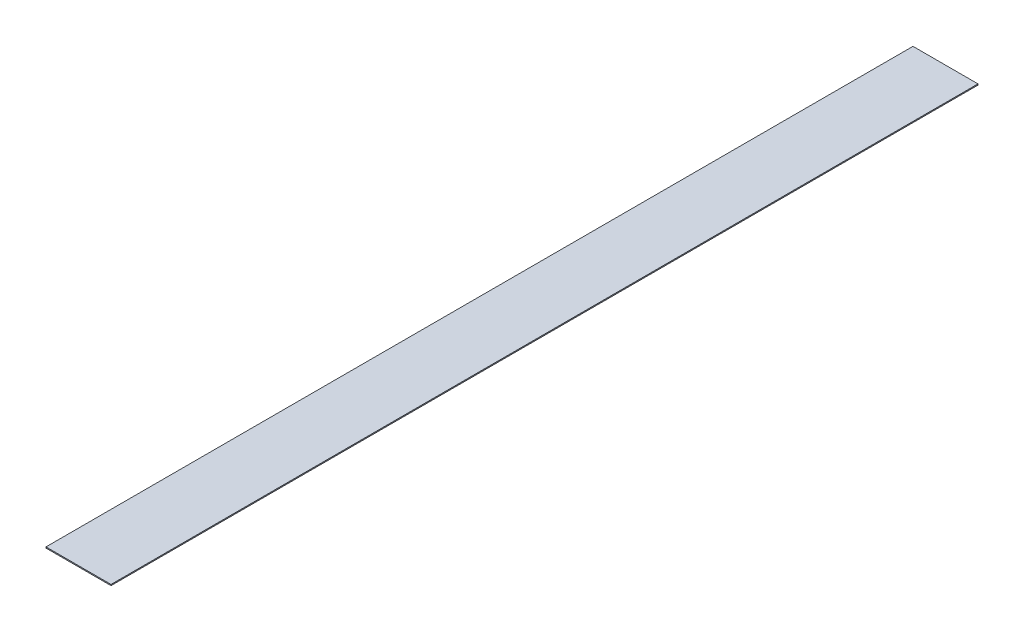
ISO-10303-21;
HEADER;
FILE_DESCRIPTION(('STEP AP214'),'2;1');
FILE_NAME('part.step','',(''),(''),'','','');
FILE_SCHEMA(('AUTOMOTIVE_DESIGN { 1 0 10303 214 1 1 1 1 }'));
ENDSEC;
DATA;
#1=APPLICATION_CONTEXT('core data for automotive mechanical design processes');
#2=APPLICATION_PROTOCOL_DEFINITION('international standard','automotive_design',2000,#1);
#3=PRODUCT_CONTEXT('',#1,'mechanical');
#4=PRODUCT('Part','Part','',(#3));
#5=PRODUCT_RELATED_PRODUCT_CATEGORY('part','',(#4));
#6=PRODUCT_DEFINITION_FORMATION('','',#4);
#7=PRODUCT_DEFINITION_CONTEXT('part definition',#1,'design');
#8=PRODUCT_DEFINITION('design','',#6,#7);
#9=PRODUCT_DEFINITION_SHAPE('','',#8);
#10=(LENGTH_UNIT() NAMED_UNIT(*) SI_UNIT(.MILLI.,.METRE.));
#11=(NAMED_UNIT(*) PLANE_ANGLE_UNIT() SI_UNIT($,.RADIAN.));
#12=(NAMED_UNIT(*) SI_UNIT($,.STERADIAN.) SOLID_ANGLE_UNIT());
#13=UNCERTAINTY_MEASURE_WITH_UNIT(LENGTH_MEASURE(1.E-05),#10,'distance_accuracy_value','');
#14=(GEOMETRIC_REPRESENTATION_CONTEXT(3) GLOBAL_UNCERTAINTY_ASSIGNED_CONTEXT((#13)) GLOBAL_UNIT_ASSIGNED_CONTEXT((#10,
#11,#12)) REPRESENTATION_CONTEXT('',''));
#15=CARTESIAN_POINT('',(0.,0.,0.));
#16=DIRECTION('',(0.,0.,1.));
#17=DIRECTION('',(1.,0.,0.));
#18=AXIS2_PLACEMENT_3D('',#15,#16,#17);
#19=CARTESIAN_POINT('',(-3000.,-100.,-40000.));
#20=DIRECTION('',(-1.,0.,0.));
#21=DIRECTION('',(0.,0.,1.));
#22=AXIS2_PLACEMENT_3D('',#19,#20,#21);
#23=PLANE('',#22);
#24=DIRECTION('',(0.,0.,1.));
#25=VECTOR('',#24,1.);
#26=CARTESIAN_POINT('',(-3000.,0.,-40000.));
#27=LINE('',#26,#25);
#28=CARTESIAN_POINT('',(-3000.,0.,-40000.));
#29=VERTEX_POINT('',#28);
#30=CARTESIAN_POINT('',(-3000.,0.,40000.));
#31=VERTEX_POINT('',#30);
#32=EDGE_CURVE('E111',#29,#31,#27,.T.);
#33=ORIENTED_EDGE('',*,*,#32,.F.);
#34=DIRECTION('',(0.,1.,0.));
#35=VECTOR('',#34,1.);
#36=CARTESIAN_POINT('',(-3000.,-100.,-40000.));
#37=LINE('',#36,#35);
#38=CARTESIAN_POINT('',(-3000.,-100.,-40000.));
#39=VERTEX_POINT('',#38);
#40=EDGE_CURVE('E11',#39,#29,#37,.T.);
#41=ORIENTED_EDGE('',*,*,#40,.F.);
#42=DIRECTION('',(0.,0.,1.));
#43=VECTOR('',#42,1.);
#44=CARTESIAN_POINT('',(-3000.,-100.,-40000.));
#45=LINE('',#44,#43);
#46=CARTESIAN_POINT('',(-3000.,-100.,40000.));
#47=VERTEX_POINT('',#46);
#48=EDGE_CURVE('E105',#39,#47,#45,.T.);
#49=ORIENTED_EDGE('',*,*,#48,.T.);
#50=DIRECTION('',(0.,1.,0.));
#51=VECTOR('',#50,1.);
#52=CARTESIAN_POINT('',(-3000.,-100.,40000.));
#53=LINE('',#52,#51);
#54=EDGE_CURVE('E50',#47,#31,#53,.T.);
#55=ORIENTED_EDGE('',*,*,#54,.T.);
#56=EDGE_LOOP('',(#33,#41,#49,#55));
#57=FACE_BOUND('',#56,.T.);
#58=ADVANCED_FACE('F47',(#57),#23,.T.);
#59=CARTESIAN_POINT('',(-3000.,-100.,-40000.));
#60=DIRECTION('',(0.,0.,-1.));
#61=DIRECTION('',(-1.,0.,0.));
#62=AXIS2_PLACEMENT_3D('',#59,#60,#61);
#63=PLANE('',#62);
#64=DIRECTION('',(-1.,0.,0.));
#65=VECTOR('',#64,1.);
#66=CARTESIAN_POINT('',(-3000.,0.,-40000.));
#67=LINE('',#66,#65);
#68=CARTESIAN_POINT('',(3000.,0.,-40000.));
#69=VERTEX_POINT('',#68);
#70=EDGE_CURVE('E107',#69,#29,#67,.T.);
#71=ORIENTED_EDGE('',*,*,#70,.F.);
#72=DIRECTION('',(0.,1.,0.));
#73=VECTOR('',#72,1.);
#74=CARTESIAN_POINT('',(3000.,-100.,-40000.));
#75=LINE('',#74,#73);
#76=CARTESIAN_POINT('',(3000.,-100.,-40000.));
#77=VERTEX_POINT('',#76);
#78=EDGE_CURVE('E56',#77,#69,#75,.T.);
#79=ORIENTED_EDGE('',*,*,#78,.F.);
#80=DIRECTION('',(-1.,0.,0.));
#81=VECTOR('',#80,1.);
#82=CARTESIAN_POINT('',(-3000.,-100.,-40000.));
#83=LINE('',#82,#81);
#84=EDGE_CURVE('E102',#77,#39,#83,.T.);
#85=ORIENTED_EDGE('',*,*,#84,.T.);
#86=ORIENTED_EDGE('',*,*,#40,.T.);
#87=EDGE_LOOP('',(#71,#79,#85,#86));
#88=FACE_BOUND('',#87,.T.);
#89=ADVANCED_FACE('F121',(#88),#63,.T.);
#90=CARTESIAN_POINT('',(3000.,-100.,-40000.));
#91=DIRECTION('',(1.,0.,0.));
#92=DIRECTION('',(0.,0.,-1.));
#93=AXIS2_PLACEMENT_3D('',#90,#91,#92);
#94=PLANE('',#93);
#95=DIRECTION('',(0.,0.,-1.));
#96=VECTOR('',#95,1.);
#97=CARTESIAN_POINT('',(3000.,0.,-40000.));
#98=LINE('',#97,#96);
#99=CARTESIAN_POINT('',(3000.,0.,40000.));
#100=VERTEX_POINT('',#99);
#101=EDGE_CURVE('E97',#100,#69,#98,.T.);
#102=ORIENTED_EDGE('',*,*,#101,.F.);
#103=DIRECTION('',(0.,1.,0.));
#104=VECTOR('',#103,1.);
#105=CARTESIAN_POINT('',(3000.,-100.,40000.));
#106=LINE('',#105,#104);
#107=CARTESIAN_POINT('',(3000.,-100.,40000.));
#108=VERTEX_POINT('',#107);
#109=EDGE_CURVE('E92',#108,#100,#106,.T.);
#110=ORIENTED_EDGE('',*,*,#109,.F.);
#111=DIRECTION('',(0.,0.,-1.));
#112=VECTOR('',#111,1.);
#113=CARTESIAN_POINT('',(3000.,-100.,-40000.));
#114=LINE('',#113,#112);
#115=EDGE_CURVE('E95',#108,#77,#114,.T.);
#116=ORIENTED_EDGE('',*,*,#115,.T.);
#117=ORIENTED_EDGE('',*,*,#78,.T.);
#118=EDGE_LOOP('',(#102,#110,#116,#117));
#119=FACE_BOUND('',#118,.T.);
#120=ADVANCED_FACE('F94',(#119),#94,.T.);
#121=CARTESIAN_POINT('',(-3000.,-100.,40000.));
#122=DIRECTION('',(0.,0.,1.));
#123=DIRECTION('',(1.,0.,0.));
#124=AXIS2_PLACEMENT_3D('',#121,#122,#123);
#125=PLANE('',#124);
#126=DIRECTION('',(1.,0.,0.));
#127=VECTOR('',#126,1.);
#128=CARTESIAN_POINT('',(-3000.,0.,40000.));
#129=LINE('',#128,#127);
#130=EDGE_CURVE('E114',#31,#100,#129,.T.);
#131=ORIENTED_EDGE('',*,*,#130,.F.);
#132=ORIENTED_EDGE('',*,*,#54,.F.);
#133=DIRECTION('',(1.,0.,0.));
#134=VECTOR('',#133,1.);
#135=CARTESIAN_POINT('',(-3000.,-100.,40000.));
#136=LINE('',#135,#134);
#137=EDGE_CURVE('E101',#47,#108,#136,.T.);
#138=ORIENTED_EDGE('',*,*,#137,.T.);
#139=ORIENTED_EDGE('',*,*,#109,.T.);
#140=EDGE_LOOP('',(#131,#132,#138,#139));
#141=FACE_BOUND('',#140,.T.);
#142=ADVANCED_FACE('F104',(#141),#125,.T.);
#143=CARTESIAN_POINT('',(0.,-100.,0.));
#144=DIRECTION('',(0.,1.,0.));
#145=DIRECTION('',(0.,0.,1.));
#146=AXIS2_PLACEMENT_3D('',#143,#144,#145);
#147=PLANE('',#146);
#148=ORIENTED_EDGE('',*,*,#48,.F.);
#149=ORIENTED_EDGE('',*,*,#84,.F.);
#150=ORIENTED_EDGE('',*,*,#115,.F.);
#151=ORIENTED_EDGE('',*,*,#137,.F.);
#152=EDGE_LOOP('',(#148,#149,#150,#151));
#153=FACE_BOUND('',#152,.T.);
#154=ADVANCED_FACE('F100',(#153),#147,.F.);
#155=CARTESIAN_POINT('',(0.,0.,0.));
#156=DIRECTION('',(0.,1.,0.));
#157=DIRECTION('',(0.,0.,1.));
#158=AXIS2_PLACEMENT_3D('',#155,#156,#157);
#159=PLANE('',#158);
#160=ORIENTED_EDGE('',*,*,#32,.T.);
#161=ORIENTED_EDGE('',*,*,#130,.T.);
#162=ORIENTED_EDGE('',*,*,#101,.T.);
#163=ORIENTED_EDGE('',*,*,#70,.T.);
#164=EDGE_LOOP('',(#160,#161,#162,#163));
#165=FACE_BOUND('',#164,.T.);
#166=ADVANCED_FACE('F120',(#165),#159,.T.);
#167=CLOSED_SHELL('',(#58,#89,#120,#142,#154,#166));
#168=MANIFOLD_SOLID_BREP('B2',#167);
#169=ADVANCED_BREP_SHAPE_REPRESENTATION('',(#18,#168),#14);
#170=SHAPE_DEFINITION_REPRESENTATION(#9,#169);
ENDSEC;
END-ISO-10303-21;
